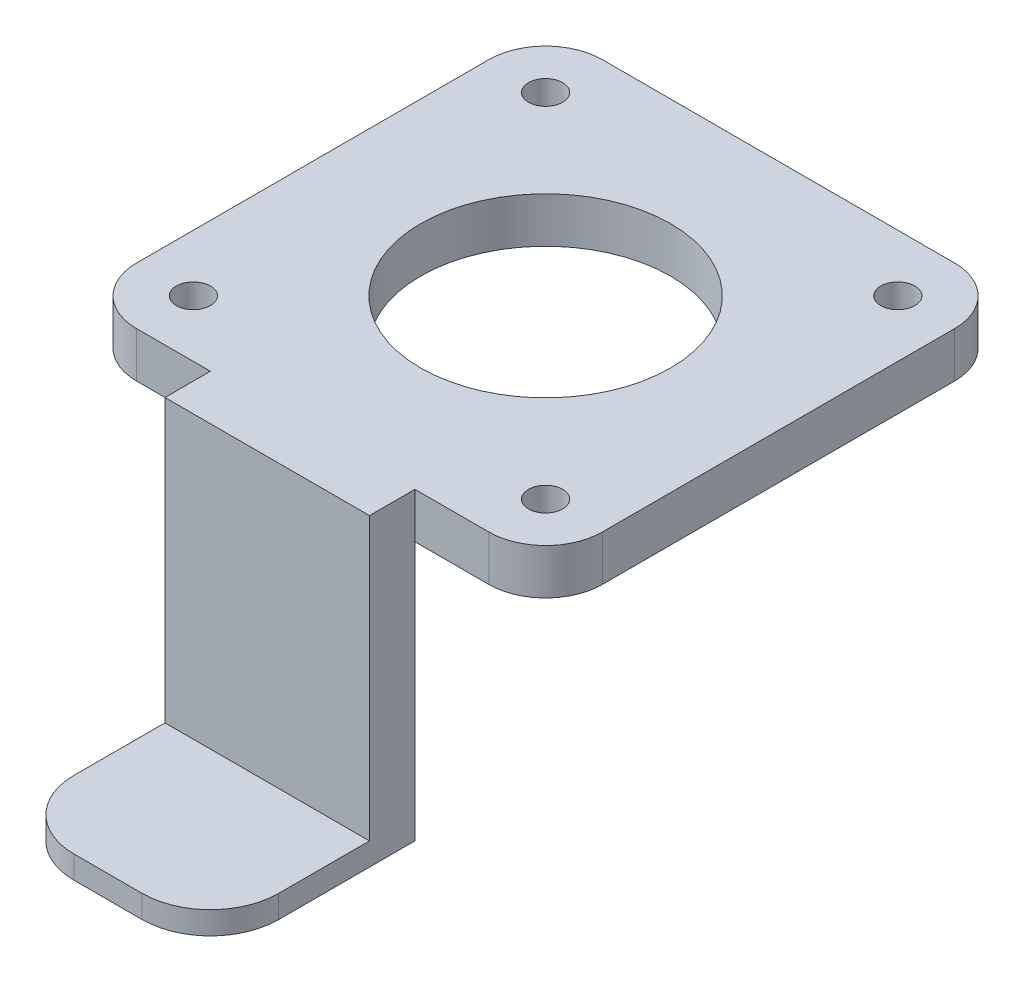
ISO-10303-21;
HEADER;
FILE_DESCRIPTION(('STEP AP214'),'2;1');
FILE_NAME('part.step','',(''),(''),'','','');
FILE_SCHEMA(('AUTOMOTIVE_DESIGN { 1 0 10303 214 1 1 1 1 }'));
ENDSEC;
DATA;
#1=APPLICATION_CONTEXT('core data for automotive mechanical design processes');
#2=APPLICATION_PROTOCOL_DEFINITION('international standard','automotive_design',2000,#1);
#3=PRODUCT_CONTEXT('',#1,'mechanical');
#4=PRODUCT('Part','Part','',(#3));
#5=PRODUCT_RELATED_PRODUCT_CATEGORY('part','',(#4));
#6=PRODUCT_DEFINITION_FORMATION('','',#4);
#7=PRODUCT_DEFINITION_CONTEXT('part definition',#1,'design');
#8=PRODUCT_DEFINITION('design','',#6,#7);
#9=PRODUCT_DEFINITION_SHAPE('','',#8);
#10=(LENGTH_UNIT() NAMED_UNIT(*) SI_UNIT(.MILLI.,.METRE.));
#11=(NAMED_UNIT(*) PLANE_ANGLE_UNIT() SI_UNIT($,.RADIAN.));
#12=(NAMED_UNIT(*) SI_UNIT($,.STERADIAN.) SOLID_ANGLE_UNIT());
#13=UNCERTAINTY_MEASURE_WITH_UNIT(LENGTH_MEASURE(1.E-05),#10,'distance_accuracy_value','');
#14=(GEOMETRIC_REPRESENTATION_CONTEXT(3) GLOBAL_UNCERTAINTY_ASSIGNED_CONTEXT((#13)) GLOBAL_UNIT_ASSIGNED_CONTEXT((#10,
#11,#12)) REPRESENTATION_CONTEXT('',''));
#15=CARTESIAN_POINT('',(0.,0.,0.));
#16=DIRECTION('',(0.,0.,1.));
#17=DIRECTION('',(1.,0.,0.));
#18=AXIS2_PLACEMENT_3D('',#15,#16,#17);
#19=CARTESIAN_POINT('',(0.,0.,24.5));
#20=DIRECTION('',(0.,0.,1.));
#21=DIRECTION('',(1.,0.,0.));
#22=AXIS2_PLACEMENT_3D('',#19,#20,#21);
#23=PLANE('',#22);
#24=DIRECTION('',(0.,-1.,0.));
#25=VECTOR('',#24,1.);
#26=CARTESIAN_POINT('',(-9.00000000000001,4.,24.5));
#27=LINE('',#26,#25);
#28=CARTESIAN_POINT('',(-9.00000000000001,4.,24.5));
#29=VERTEX_POINT('',#28);
#30=CARTESIAN_POINT('',(-9.,-20.8,24.5));
#31=VERTEX_POINT('',#30);
#32=EDGE_CURVE('E210',#29,#31,#27,.T.);
#33=ORIENTED_EDGE('',*,*,#32,.T.);
#34=DIRECTION('',(1.,0.,0.));
#35=VECTOR('',#34,1.);
#36=CARTESIAN_POINT('',(9.,-20.8,24.5));
#37=LINE('',#36,#35);
#38=CARTESIAN_POINT('',(9.,-20.8,24.5));
#39=VERTEX_POINT('',#38);
#40=EDGE_CURVE('E175',#31,#39,#37,.T.);
#41=ORIENTED_EDGE('',*,*,#40,.T.);
#42=DIRECTION('',(0.,-1.,0.));
#43=VECTOR('',#42,1.);
#44=CARTESIAN_POINT('',(8.99999999999999,4.,24.5));
#45=LINE('',#44,#43);
#46=CARTESIAN_POINT('',(8.99999999999999,4.,24.5));
#47=VERTEX_POINT('',#46);
#48=EDGE_CURVE('E186',#47,#39,#45,.T.);
#49=ORIENTED_EDGE('',*,*,#48,.F.);
#50=DIRECTION('',(1.,0.,0.));
#51=VECTOR('',#50,1.);
#52=CARTESIAN_POINT('',(-9.00000000000001,4.,24.5));
#53=LINE('',#52,#51);
#54=EDGE_CURVE('E214',#29,#47,#53,.T.);
#55=ORIENTED_EDGE('',*,*,#54,.F.);
#56=EDGE_LOOP('',(#33,#41,#49,#55));
#57=FACE_BOUND('',#56,.T.);
#58=ADVANCED_FACE('F45',(#57),#23,.T.);
#59=CARTESIAN_POINT('',(-15.5,4.,20.5));
#60=DIRECTION('',(0.,0.,-1.));
#61=DIRECTION('',(-1.,0.,0.));
#62=AXIS2_PLACEMENT_3D('',#59,#60,#61);
#63=PLANE('',#62);
#64=DIRECTION('',(0.,-1.,0.));
#65=VECTOR('',#64,1.);
#66=CARTESIAN_POINT('',(-9.00000000000001,4.,20.5));
#67=LINE('',#66,#65);
#68=CARTESIAN_POINT('',(-9.00000000000001,4.,20.5));
#69=VERTEX_POINT('',#68);
#70=CARTESIAN_POINT('',(-9.00000000000001,0.,20.5));
#71=VERTEX_POINT('',#70);
#72=EDGE_CURVE('E218',#69,#71,#67,.T.);
#73=ORIENTED_EDGE('',*,*,#72,.F.);
#74=DIRECTION('',(1.,0.,0.));
#75=VECTOR('',#74,1.);
#76=CARTESIAN_POINT('',(-15.5,4.,20.5));
#77=LINE('',#76,#75);
#78=CARTESIAN_POINT('',(-15.5,4.,20.5));
#79=VERTEX_POINT('',#78);
#80=EDGE_CURVE('E274',#79,#69,#77,.T.);
#81=ORIENTED_EDGE('',*,*,#80,.F.);
#82=DIRECTION('',(0.,-1.,0.));
#83=VECTOR('',#82,1.);
#84=CARTESIAN_POINT('',(-15.5,4.,20.5));
#85=LINE('',#84,#83);
#86=CARTESIAN_POINT('',(-15.5,0.,20.5));
#87=VERTEX_POINT('',#86);
#88=EDGE_CURVE('E318',#79,#87,#85,.T.);
#89=ORIENTED_EDGE('',*,*,#88,.T.);
#90=DIRECTION('',(1.,0.,0.));
#91=VECTOR('',#90,1.);
#92=CARTESIAN_POINT('',(-15.5,0.,20.5));
#93=LINE('',#92,#91);
#94=EDGE_CURVE('E293',#87,#71,#93,.T.);
#95=ORIENTED_EDGE('',*,*,#94,.T.);
#96=EDGE_LOOP('',(#73,#81,#89,#95));
#97=FACE_BOUND('',#96,.T.);
#98=ADVANCED_FACE('F337',(#97),#63,.F.);
#99=CARTESIAN_POINT('',(-15.5,4.,-15.5));
#100=DIRECTION('',(0.,1.,0.));
#101=DIRECTION('',(0.,0.,1.));
#102=AXIS2_PLACEMENT_3D('',#99,#100,#101);
#103=PLANE('',#102);
#104=CARTESIAN_POINT('',(-15.5,4.,15.5));
#105=DIRECTION('',(0.,1.,0.));
#106=DIRECTION('',(0.,0.,-1.));
#107=AXIS2_PLACEMENT_3D('',#104,#105,#106);
#108=CIRCLE('',#107,1.5);
#109=CARTESIAN_POINT('',(-15.5,4.,14.));
#110=VERTEX_POINT('',#109);
#111=EDGE_CURVE('E241',#110,#110,#108,.T.);
#112=ORIENTED_EDGE('',*,*,#111,.F.);
#113=EDGE_LOOP('',(#112));
#114=FACE_BOUND('',#113,.T.);
#115=CARTESIAN_POINT('',(-15.5,4.,-15.5));
#116=DIRECTION('',(0.,1.,0.));
#117=DIRECTION('',(0.,0.,1.));
#118=AXIS2_PLACEMENT_3D('',#115,#116,#117);
#119=CIRCLE('',#118,1.5);
#120=CARTESIAN_POINT('',(-15.5,4.,-14.));
#121=VERTEX_POINT('',#120);
#122=EDGE_CURVE('E253',#121,#121,#119,.T.);
#123=ORIENTED_EDGE('',*,*,#122,.F.);
#124=EDGE_LOOP('',(#123));
#125=FACE_BOUND('',#124,.T.);
#126=CARTESIAN_POINT('',(-15.5,4.,-15.5));
#127=DIRECTION('',(0.,1.,0.));
#128=DIRECTION('',(0.,0.,1.));
#129=AXIS2_PLACEMENT_3D('',#126,#127,#128);
#130=CIRCLE('',#129,5.);
#131=CARTESIAN_POINT('',(-15.5,4.,-20.5));
#132=VERTEX_POINT('',#131);
#133=CARTESIAN_POINT('',(-20.5,4.,-15.5));
#134=VERTEX_POINT('',#133);
#135=EDGE_CURVE('E265',#132,#134,#130,.T.);
#136=ORIENTED_EDGE('',*,*,#135,.T.);
#137=DIRECTION('',(0.,0.,1.));
#138=VECTOR('',#137,1.);
#139=CARTESIAN_POINT('',(-20.5,4.,15.5));
#140=LINE('',#139,#138);
#141=CARTESIAN_POINT('',(-20.5,4.,15.5));
#142=VERTEX_POINT('',#141);
#143=EDGE_CURVE('E268',#134,#142,#140,.T.);
#144=ORIENTED_EDGE('',*,*,#143,.T.);
#145=CARTESIAN_POINT('',(-15.5,4.,15.5));
#146=DIRECTION('',(0.,1.,0.));
#147=DIRECTION('',(0.,0.,-1.));
#148=AXIS2_PLACEMENT_3D('',#145,#146,#147);
#149=CIRCLE('',#148,5.);
#150=EDGE_CURVE('E271',#142,#79,#149,.T.);
#151=ORIENTED_EDGE('',*,*,#150,.T.);
#152=ORIENTED_EDGE('',*,*,#80,.T.);
#153=DIRECTION('',(0.,0.,-1.));
#154=VECTOR('',#153,1.);
#155=CARTESIAN_POINT('',(-9.00000000000001,4.,24.5));
#156=LINE('',#155,#154);
#157=EDGE_CURVE('E217',#29,#69,#156,.T.);
#158=ORIENTED_EDGE('',*,*,#157,.F.);
#159=ORIENTED_EDGE('',*,*,#54,.T.);
#160=DIRECTION('',(0.,0.,-1.));
#161=VECTOR('',#160,1.);
#162=CARTESIAN_POINT('',(8.99999999999999,4.,24.5));
#163=LINE('',#162,#161);
#164=CARTESIAN_POINT('',(8.99999999999999,4.,20.5));
#165=VERTEX_POINT('',#164);
#166=EDGE_CURVE('E227',#47,#165,#163,.T.);
#167=ORIENTED_EDGE('',*,*,#166,.T.);
#168=CARTESIAN_POINT('',(15.5,4.,20.5));
#169=VERTEX_POINT('',#168);
#170=EDGE_CURVE('E273',#165,#169,#77,.T.);
#171=ORIENTED_EDGE('',*,*,#170,.T.);
#172=CARTESIAN_POINT('',(15.5,4.,15.5));
#173=DIRECTION('',(0.,1.,0.));
#174=DIRECTION('',(0.,0.,1.));
#175=AXIS2_PLACEMENT_3D('',#172,#173,#174);
#176=CIRCLE('',#175,5.);
#177=CARTESIAN_POINT('',(20.5,4.,15.5));
#178=VERTEX_POINT('',#177);
#179=EDGE_CURVE('E277',#169,#178,#176,.T.);
#180=ORIENTED_EDGE('',*,*,#179,.T.);
#181=DIRECTION('',(0.,0.,-1.));
#182=VECTOR('',#181,1.);
#183=CARTESIAN_POINT('',(20.5,4.,15.5));
#184=LINE('',#183,#182);
#185=CARTESIAN_POINT('',(20.5,4.,-15.5));
#186=VERTEX_POINT('',#185);
#187=EDGE_CURVE('E279',#178,#186,#184,.T.);
#188=ORIENTED_EDGE('',*,*,#187,.T.);
#189=CARTESIAN_POINT('',(15.5,4.,-15.5));
#190=DIRECTION('',(0.,1.,0.));
#191=DIRECTION('',(0.,0.,1.));
#192=AXIS2_PLACEMENT_3D('',#189,#190,#191);
#193=CIRCLE('',#192,5.);
#194=CARTESIAN_POINT('',(15.5,4.,-20.5));
#195=VERTEX_POINT('',#194);
#196=EDGE_CURVE('E281',#186,#195,#193,.T.);
#197=ORIENTED_EDGE('',*,*,#196,.T.);
#198=DIRECTION('',(-1.,0.,0.));
#199=VECTOR('',#198,1.);
#200=CARTESIAN_POINT('',(-15.5,4.,-20.5));
#201=LINE('',#200,#199);
#202=EDGE_CURVE('E283',#195,#132,#201,.T.);
#203=ORIENTED_EDGE('',*,*,#202,.T.);
#204=EDGE_LOOP('',(#136,#144,#151,#152,#158,#159,#167,#171,#180,#188,#197,#203));
#205=FACE_BOUND('',#204,.T.);
#206=CARTESIAN_POINT('',(0.,4.,0.));
#207=DIRECTION('',(0.,1.,0.));
#208=DIRECTION('',(0.,0.,1.));
#209=AXIS2_PLACEMENT_3D('',#206,#207,#208);
#210=CIRCLE('',#209,11.);
#211=CARTESIAN_POINT('',(0.,4.,11.));
#212=VERTEX_POINT('',#211);
#213=EDGE_CURVE('E259',#212,#212,#210,.T.);
#214=ORIENTED_EDGE('',*,*,#213,.F.);
#215=EDGE_LOOP('',(#214));
#216=FACE_BOUND('',#215,.T.);
#217=CARTESIAN_POINT('',(15.5,4.,15.5));
#218=DIRECTION('',(0.,1.,0.));
#219=DIRECTION('',(0.,0.,-1.));
#220=AXIS2_PLACEMENT_3D('',#217,#218,#219);
#221=CIRCLE('',#220,1.5);
#222=CARTESIAN_POINT('',(15.5,4.,14.));
#223=VERTEX_POINT('',#222);
#224=EDGE_CURVE('E247',#223,#223,#221,.T.);
#225=ORIENTED_EDGE('',*,*,#224,.F.);
#226=EDGE_LOOP('',(#225));
#227=FACE_BOUND('',#226,.T.);
#228=CARTESIAN_POINT('',(15.5,4.,-15.5));
#229=DIRECTION('',(0.,1.,0.));
#230=DIRECTION('',(0.,0.,1.));
#231=AXIS2_PLACEMENT_3D('',#228,#229,#230);
#232=CIRCLE('',#231,1.49999999999999);
#233=CARTESIAN_POINT('',(15.5,4.,-14.));
#234=VERTEX_POINT('',#233);
#235=EDGE_CURVE('E235',#234,#234,#232,.T.);
#236=ORIENTED_EDGE('',*,*,#235,.F.);
#237=EDGE_LOOP('',(#236));
#238=FACE_BOUND('',#237,.T.);
#239=ADVANCED_FACE('F340',(#114,#125,#205,#216,#227,#238),#103,.T.);
#240=CARTESIAN_POINT('',(-15.5,0.,-15.5));
#241=DIRECTION('',(0.,1.,0.));
#242=DIRECTION('',(0.,0.,1.));
#243=AXIS2_PLACEMENT_3D('',#240,#241,#242);
#244=PLANE('',#243);
#245=CARTESIAN_POINT('',(-15.5,0.,-15.5));
#246=DIRECTION('',(0.,1.,0.));
#247=DIRECTION('',(0.,0.,1.));
#248=AXIS2_PLACEMENT_3D('',#245,#246,#247);
#249=CIRCLE('',#248,5.);
#250=CARTESIAN_POINT('',(-15.5,0.,-20.5));
#251=VERTEX_POINT('',#250);
#252=CARTESIAN_POINT('',(-20.5,0.,-15.5));
#253=VERTEX_POINT('',#252);
#254=EDGE_CURVE('E262',#251,#253,#249,.T.);
#255=ORIENTED_EDGE('',*,*,#254,.F.);
#256=DIRECTION('',(-1.,0.,0.));
#257=VECTOR('',#256,1.);
#258=CARTESIAN_POINT('',(-15.5,0.,-20.5));
#259=LINE('',#258,#257);
#260=CARTESIAN_POINT('',(15.5,0.,-20.5));
#261=VERTEX_POINT('',#260);
#262=EDGE_CURVE('E269',#261,#251,#259,.T.);
#263=ORIENTED_EDGE('',*,*,#262,.F.);
#264=CARTESIAN_POINT('',(15.5,0.,-15.5));
#265=DIRECTION('',(0.,1.,0.));
#266=DIRECTION('',(0.,0.,1.));
#267=AXIS2_PLACEMENT_3D('',#264,#265,#266);
#268=CIRCLE('',#267,5.);
#269=CARTESIAN_POINT('',(20.5,0.,-15.5));
#270=VERTEX_POINT('',#269);
#271=EDGE_CURVE('E301',#270,#261,#268,.T.);
#272=ORIENTED_EDGE('',*,*,#271,.F.);
#273=DIRECTION('',(0.,0.,-1.));
#274=VECTOR('',#273,1.);
#275=CARTESIAN_POINT('',(20.5,0.,15.5));
#276=LINE('',#275,#274);
#277=CARTESIAN_POINT('',(20.5,0.,15.5));
#278=VERTEX_POINT('',#277);
#279=EDGE_CURVE('E299',#278,#270,#276,.T.);
#280=ORIENTED_EDGE('',*,*,#279,.F.);
#281=CARTESIAN_POINT('',(15.5,0.,15.5));
#282=DIRECTION('',(0.,1.,0.));
#283=DIRECTION('',(0.,0.,1.));
#284=AXIS2_PLACEMENT_3D('',#281,#282,#283);
#285=CIRCLE('',#284,5.);
#286=CARTESIAN_POINT('',(15.5,0.,20.5));
#287=VERTEX_POINT('',#286);
#288=EDGE_CURVE('E296',#287,#278,#285,.T.);
#289=ORIENTED_EDGE('',*,*,#288,.F.);
#290=CARTESIAN_POINT('',(8.99999999999999,0.,20.5));
#291=VERTEX_POINT('',#290);
#292=EDGE_CURVE('E292',#291,#287,#93,.T.);
#293=ORIENTED_EDGE('',*,*,#292,.F.);
#294=EDGE_CURVE('E297',#71,#291,#93,.T.);
#295=ORIENTED_EDGE('',*,*,#294,.F.);
#296=ORIENTED_EDGE('',*,*,#94,.F.);
#297=CARTESIAN_POINT('',(-15.5,0.,15.5));
#298=DIRECTION('',(0.,1.,0.));
#299=DIRECTION('',(0.,0.,-1.));
#300=AXIS2_PLACEMENT_3D('',#297,#298,#299);
#301=CIRCLE('',#300,5.);
#302=CARTESIAN_POINT('',(-20.5,0.,15.5));
#303=VERTEX_POINT('',#302);
#304=EDGE_CURVE('E290',#303,#87,#301,.T.);
#305=ORIENTED_EDGE('',*,*,#304,.F.);
#306=DIRECTION('',(0.,0.,1.));
#307=VECTOR('',#306,1.);
#308=CARTESIAN_POINT('',(-20.5,0.,15.5));
#309=LINE('',#308,#307);
#310=EDGE_CURVE('E288',#253,#303,#309,.T.);
#311=ORIENTED_EDGE('',*,*,#310,.F.);
#312=EDGE_LOOP('',(#255,#263,#272,#280,#289,#293,#295,#296,#305,#311));
#313=FACE_BOUND('',#312,.T.);
#314=CARTESIAN_POINT('',(0.,0.,0.));
#315=DIRECTION('',(0.,1.,0.));
#316=DIRECTION('',(0.,0.,1.));
#317=AXIS2_PLACEMENT_3D('',#314,#315,#316);
#318=CIRCLE('',#317,11.);
#319=CARTESIAN_POINT('',(0.,0.,11.));
#320=VERTEX_POINT('',#319);
#321=EDGE_CURVE('E256',#320,#320,#318,.T.);
#322=ORIENTED_EDGE('',*,*,#321,.T.);
#323=EDGE_LOOP('',(#322));
#324=FACE_BOUND('',#323,.T.);
#325=CARTESIAN_POINT('',(-15.5,0.,-15.5));
#326=DIRECTION('',(0.,1.,0.));
#327=DIRECTION('',(0.,0.,1.));
#328=AXIS2_PLACEMENT_3D('',#325,#326,#327);
#329=CIRCLE('',#328,1.5);
#330=CARTESIAN_POINT('',(-15.5,0.,-14.));
#331=VERTEX_POINT('',#330);
#332=EDGE_CURVE('E250',#331,#331,#329,.T.);
#333=ORIENTED_EDGE('',*,*,#332,.T.);
#334=EDGE_LOOP('',(#333));
#335=FACE_BOUND('',#334,.T.);
#336=CARTESIAN_POINT('',(15.5,0.,15.5));
#337=DIRECTION('',(0.,1.,0.));
#338=DIRECTION('',(0.,0.,-1.));
#339=AXIS2_PLACEMENT_3D('',#336,#337,#338);
#340=CIRCLE('',#339,1.5);
#341=CARTESIAN_POINT('',(15.5,0.,14.));
#342=VERTEX_POINT('',#341);
#343=EDGE_CURVE('E244',#342,#342,#340,.T.);
#344=ORIENTED_EDGE('',*,*,#343,.T.);
#345=EDGE_LOOP('',(#344));
#346=FACE_BOUND('',#345,.T.);
#347=CARTESIAN_POINT('',(-15.5,0.,15.5));
#348=DIRECTION('',(0.,1.,0.));
#349=DIRECTION('',(0.,0.,-1.));
#350=AXIS2_PLACEMENT_3D('',#347,#348,#349);
#351=CIRCLE('',#350,1.5);
#352=CARTESIAN_POINT('',(-15.5,0.,14.));
#353=VERTEX_POINT('',#352);
#354=EDGE_CURVE('E238',#353,#353,#351,.T.);
#355=ORIENTED_EDGE('',*,*,#354,.T.);
#356=EDGE_LOOP('',(#355));
#357=FACE_BOUND('',#356,.T.);
#358=CARTESIAN_POINT('',(15.5,0.,-15.5));
#359=DIRECTION('',(0.,1.,0.));
#360=DIRECTION('',(0.,0.,1.));
#361=AXIS2_PLACEMENT_3D('',#358,#359,#360);
#362=CIRCLE('',#361,1.49999999999999);
#363=CARTESIAN_POINT('',(15.5,0.,-14.));
#364=VERTEX_POINT('',#363);
#365=EDGE_CURVE('E234',#364,#364,#362,.T.);
#366=ORIENTED_EDGE('',*,*,#365,.T.);
#367=EDGE_LOOP('',(#366));
#368=FACE_BOUND('',#367,.T.);
#369=ADVANCED_FACE('F331',(#313,#324,#335,#346,#357,#368),#244,.F.);
#370=CARTESIAN_POINT('',(-15.5,4.,-15.5));
#371=DIRECTION('',(0.,-1.,0.));
#372=DIRECTION('',(0.,0.,-1.));
#373=AXIS2_PLACEMENT_3D('',#370,#371,#372);
#374=CYLINDRICAL_SURFACE('',#373,5.);
#375=ORIENTED_EDGE('',*,*,#254,.T.);
#376=DIRECTION('',(0.,-1.,0.));
#377=VECTOR('',#376,1.);
#378=CARTESIAN_POINT('',(-20.5,4.,-15.5));
#379=LINE('',#378,#377);
#380=EDGE_CURVE('E11',#134,#253,#379,.T.);
#381=ORIENTED_EDGE('',*,*,#380,.F.);
#382=ORIENTED_EDGE('',*,*,#135,.F.);
#383=DIRECTION('',(0.,-1.,0.));
#384=VECTOR('',#383,1.);
#385=CARTESIAN_POINT('',(-15.5,4.,-20.5));
#386=LINE('',#385,#384);
#387=EDGE_CURVE('E285',#132,#251,#386,.T.);
#388=ORIENTED_EDGE('',*,*,#387,.T.);
#389=EDGE_LOOP('',(#375,#381,#382,#388));
#390=FACE_BOUND('',#389,.T.);
#391=ADVANCED_FACE('F47',(#390),#374,.T.);
#392=CARTESIAN_POINT('',(-20.5,4.,15.5));
#393=DIRECTION('',(1.,0.,0.));
#394=DIRECTION('',(0.,0.,-1.));
#395=AXIS2_PLACEMENT_3D('',#392,#393,#394);
#396=PLANE('',#395);
#397=ORIENTED_EDGE('',*,*,#310,.T.);
#398=DIRECTION('',(0.,-1.,0.));
#399=VECTOR('',#398,1.);
#400=CARTESIAN_POINT('',(-20.5,4.,15.5));
#401=LINE('',#400,#399);
#402=EDGE_CURVE('E53',#142,#303,#401,.T.);
#403=ORIENTED_EDGE('',*,*,#402,.F.);
#404=ORIENTED_EDGE('',*,*,#143,.F.);
#405=ORIENTED_EDGE('',*,*,#380,.T.);
#406=EDGE_LOOP('',(#397,#403,#404,#405));
#407=FACE_BOUND('',#406,.T.);
#408=ADVANCED_FACE('F345',(#407),#396,.F.);
#409=CARTESIAN_POINT('',(-15.5,4.,15.5));
#410=DIRECTION('',(0.,-1.,0.));
#411=DIRECTION('',(0.,0.,-1.));
#412=AXIS2_PLACEMENT_3D('',#409,#410,#411);
#413=CYLINDRICAL_SURFACE('',#412,5.);
#414=ORIENTED_EDGE('',*,*,#304,.T.);
#415=ORIENTED_EDGE('',*,*,#88,.F.);
#416=ORIENTED_EDGE('',*,*,#150,.F.);
#417=ORIENTED_EDGE('',*,*,#402,.T.);
#418=EDGE_LOOP('',(#414,#415,#416,#417));
#419=FACE_BOUND('',#418,.T.);
#420=ADVANCED_FACE('F325',(#419),#413,.T.);
#421=ORIENTED_EDGE('',*,*,#170,.F.);
#422=DIRECTION('',(0.,-1.,0.));
#423=VECTOR('',#422,1.);
#424=CARTESIAN_POINT('',(8.99999999999999,4.,20.5));
#425=LINE('',#424,#423);
#426=EDGE_CURVE('E68',#165,#291,#425,.T.);
#427=ORIENTED_EDGE('',*,*,#426,.T.);
#428=ORIENTED_EDGE('',*,*,#292,.T.);
#429=DIRECTION('',(0.,-1.,0.));
#430=VECTOR('',#429,1.);
#431=CARTESIAN_POINT('',(15.5,4.,20.5));
#432=LINE('',#431,#430);
#433=EDGE_CURVE('E315',#169,#287,#432,.T.);
#434=ORIENTED_EDGE('',*,*,#433,.F.);
#435=EDGE_LOOP('',(#421,#427,#428,#434));
#436=FACE_BOUND('',#435,.T.);
#437=ADVANCED_FACE('F370',(#436),#63,.F.);
#438=CARTESIAN_POINT('',(15.5,4.,15.5));
#439=DIRECTION('',(0.,-1.,0.));
#440=DIRECTION('',(0.,0.,-1.));
#441=AXIS2_PLACEMENT_3D('',#438,#439,#440);
#442=CYLINDRICAL_SURFACE('',#441,5.);
#443=ORIENTED_EDGE('',*,*,#288,.T.);
#444=DIRECTION('',(0.,-1.,0.));
#445=VECTOR('',#444,1.);
#446=CARTESIAN_POINT('',(20.5,4.,15.5));
#447=LINE('',#446,#445);
#448=EDGE_CURVE('E312',#178,#278,#447,.T.);
#449=ORIENTED_EDGE('',*,*,#448,.F.);
#450=ORIENTED_EDGE('',*,*,#179,.F.);
#451=ORIENTED_EDGE('',*,*,#433,.T.);
#452=EDGE_LOOP('',(#443,#449,#450,#451));
#453=FACE_BOUND('',#452,.T.);
#454=ADVANCED_FACE('F365',(#453),#442,.T.);
#455=CARTESIAN_POINT('',(20.5,4.,15.5));
#456=DIRECTION('',(-1.,0.,0.));
#457=DIRECTION('',(0.,0.,1.));
#458=AXIS2_PLACEMENT_3D('',#455,#456,#457);
#459=PLANE('',#458);
#460=ORIENTED_EDGE('',*,*,#279,.T.);
#461=DIRECTION('',(0.,-1.,0.));
#462=VECTOR('',#461,1.);
#463=CARTESIAN_POINT('',(20.5,4.,-15.5));
#464=LINE('',#463,#462);
#465=EDGE_CURVE('E309',#186,#270,#464,.T.);
#466=ORIENTED_EDGE('',*,*,#465,.F.);
#467=ORIENTED_EDGE('',*,*,#187,.F.);
#468=ORIENTED_EDGE('',*,*,#448,.T.);
#469=EDGE_LOOP('',(#460,#466,#467,#468));
#470=FACE_BOUND('',#469,.T.);
#471=ADVANCED_FACE('F361',(#470),#459,.F.);
#472=CARTESIAN_POINT('',(15.5,4.,-15.5));
#473=DIRECTION('',(0.,-1.,0.));
#474=DIRECTION('',(0.,0.,-1.));
#475=AXIS2_PLACEMENT_3D('',#472,#473,#474);
#476=CYLINDRICAL_SURFACE('',#475,5.);
#477=ORIENTED_EDGE('',*,*,#271,.T.);
#478=DIRECTION('',(0.,-1.,0.));
#479=VECTOR('',#478,1.);
#480=CARTESIAN_POINT('',(15.5,4.,-20.5));
#481=LINE('',#480,#479);
#482=EDGE_CURVE('E306',#195,#261,#481,.T.);
#483=ORIENTED_EDGE('',*,*,#482,.F.);
#484=ORIENTED_EDGE('',*,*,#196,.F.);
#485=ORIENTED_EDGE('',*,*,#465,.T.);
#486=EDGE_LOOP('',(#477,#483,#484,#485));
#487=FACE_BOUND('',#486,.T.);
#488=ADVANCED_FACE('F357',(#487),#476,.T.);
#489=CARTESIAN_POINT('',(-15.5,4.,-20.5));
#490=DIRECTION('',(0.,0.,1.));
#491=DIRECTION('',(1.,0.,0.));
#492=AXIS2_PLACEMENT_3D('',#489,#490,#491);
#493=PLANE('',#492);
#494=ORIENTED_EDGE('',*,*,#262,.T.);
#495=ORIENTED_EDGE('',*,*,#387,.F.);
#496=ORIENTED_EDGE('',*,*,#202,.F.);
#497=ORIENTED_EDGE('',*,*,#482,.T.);
#498=EDGE_LOOP('',(#494,#495,#496,#497));
#499=FACE_BOUND('',#498,.T.);
#500=ADVANCED_FACE('F352',(#499),#493,.F.);
#501=CARTESIAN_POINT('',(0.,4.,0.));
#502=DIRECTION('',(0.,-1.,0.));
#503=DIRECTION('',(0.,0.,-1.));
#504=AXIS2_PLACEMENT_3D('',#501,#502,#503);
#505=CYLINDRICAL_SURFACE('',#504,11.);
#506=ORIENTED_EDGE('',*,*,#213,.T.);
#507=EDGE_LOOP('',(#506));
#508=FACE_BOUND('',#507,.T.);
#509=ORIENTED_EDGE('',*,*,#321,.F.);
#510=EDGE_LOOP('',(#509));
#511=FACE_BOUND('',#510,.T.);
#512=ADVANCED_FACE('F424',(#508,#511),#505,.F.);
#513=CARTESIAN_POINT('',(-15.5,4.,-15.5));
#514=DIRECTION('',(0.,-1.,0.));
#515=DIRECTION('',(0.,0.,-1.));
#516=AXIS2_PLACEMENT_3D('',#513,#514,#515);
#517=CYLINDRICAL_SURFACE('',#516,1.5);
#518=ORIENTED_EDGE('',*,*,#122,.T.);
#519=EDGE_LOOP('',(#518));
#520=FACE_BOUND('',#519,.T.);
#521=ORIENTED_EDGE('',*,*,#332,.F.);
#522=EDGE_LOOP('',(#521));
#523=FACE_BOUND('',#522,.T.);
#524=ADVANCED_FACE('F420',(#520,#523),#517,.F.);
#525=CARTESIAN_POINT('',(15.5,4.,15.5));
#526=DIRECTION('',(0.,-1.,0.));
#527=DIRECTION('',(0.,0.,-1.));
#528=AXIS2_PLACEMENT_3D('',#525,#526,#527);
#529=CYLINDRICAL_SURFACE('',#528,1.5);
#530=ORIENTED_EDGE('',*,*,#224,.T.);
#531=EDGE_LOOP('',(#530));
#532=FACE_BOUND('',#531,.T.);
#533=ORIENTED_EDGE('',*,*,#343,.F.);
#534=EDGE_LOOP('',(#533));
#535=FACE_BOUND('',#534,.T.);
#536=ADVANCED_FACE('F416',(#532,#535),#529,.F.);
#537=CARTESIAN_POINT('',(-15.5,4.,15.5));
#538=DIRECTION('',(0.,-1.,0.));
#539=DIRECTION('',(0.,0.,-1.));
#540=AXIS2_PLACEMENT_3D('',#537,#538,#539);
#541=CYLINDRICAL_SURFACE('',#540,1.5);
#542=ORIENTED_EDGE('',*,*,#111,.T.);
#543=EDGE_LOOP('',(#542));
#544=FACE_BOUND('',#543,.T.);
#545=ORIENTED_EDGE('',*,*,#354,.F.);
#546=EDGE_LOOP('',(#545));
#547=FACE_BOUND('',#546,.T.);
#548=ADVANCED_FACE('F412',(#544,#547),#541,.F.);
#549=CARTESIAN_POINT('',(15.5,4.,-15.5));
#550=DIRECTION('',(0.,-1.,0.));
#551=DIRECTION('',(0.,0.,-1.));
#552=AXIS2_PLACEMENT_3D('',#549,#550,#551);
#553=CYLINDRICAL_SURFACE('',#552,1.49999999999999);
#554=ORIENTED_EDGE('',*,*,#235,.T.);
#555=EDGE_LOOP('',(#554));
#556=FACE_BOUND('',#555,.T.);
#557=ORIENTED_EDGE('',*,*,#365,.F.);
#558=EDGE_LOOP('',(#557));
#559=FACE_BOUND('',#558,.T.);
#560=ADVANCED_FACE('F404',(#556,#559),#553,.F.);
#561=CARTESIAN_POINT('',(0.,0.,20.5));
#562=DIRECTION('',(0.,0.,1.));
#563=DIRECTION('',(1.,0.,0.));
#564=AXIS2_PLACEMENT_3D('',#561,#562,#563);
#565=PLANE('',#564);
#566=CARTESIAN_POINT('',(-9.,-22.8,20.5));
#567=VERTEX_POINT('',#566);
#568=EDGE_CURVE('E206',#71,#567,#67,.T.);
#569=ORIENTED_EDGE('',*,*,#568,.F.);
#570=ORIENTED_EDGE('',*,*,#294,.T.);
#571=CARTESIAN_POINT('',(9.,-22.8,20.5));
#572=VERTEX_POINT('',#571);
#573=EDGE_CURVE('E224',#291,#572,#425,.T.);
#574=ORIENTED_EDGE('',*,*,#573,.T.);
#575=DIRECTION('',(1.,0.,0.));
#576=VECTOR('',#575,1.);
#577=CARTESIAN_POINT('',(-9.,-22.8,20.5));
#578=LINE('',#577,#576);
#579=EDGE_CURVE('E221',#567,#572,#578,.T.);
#580=ORIENTED_EDGE('',*,*,#579,.F.);
#581=EDGE_LOOP('',(#569,#570,#574,#580));
#582=FACE_BOUND('',#581,.T.);
#583=ADVANCED_FACE('F372',(#582),#565,.F.);
#584=CARTESIAN_POINT('',(-9.00000000000001,4.,24.5));
#585=DIRECTION('',(1.,0.,0.));
#586=DIRECTION('',(0.,1.,0.));
#587=AXIS2_PLACEMENT_3D('',#584,#585,#586);
#588=PLANE('',#587);
#589=ORIENTED_EDGE('',*,*,#72,.T.);
#590=ORIENTED_EDGE('',*,*,#568,.T.);
#591=DIRECTION('',(0.,0.,-1.));
#592=VECTOR('',#591,1.);
#593=CARTESIAN_POINT('',(-9.,-22.8,24.5));
#594=LINE('',#593,#592);
#595=CARTESIAN_POINT('',(-9.,-22.8,32.5));
#596=VERTEX_POINT('',#595);
#597=EDGE_CURVE('E231',#596,#567,#594,.T.);
#598=ORIENTED_EDGE('',*,*,#597,.F.);
#599=DIRECTION('',(0.,-1.,0.));
#600=VECTOR('',#599,1.);
#601=CARTESIAN_POINT('',(-9.,-20.8,32.5));
#602=LINE('',#601,#600);
#603=CARTESIAN_POINT('',(-9.,-20.8,32.5));
#604=VERTEX_POINT('',#603);
#605=EDGE_CURVE('E203',#604,#596,#602,.T.);
#606=ORIENTED_EDGE('',*,*,#605,.F.);
#607=DIRECTION('',(0.,0.,-1.));
#608=VECTOR('',#607,1.);
#609=CARTESIAN_POINT('',(-9.,-20.8,24.5));
#610=LINE('',#609,#608);
#611=EDGE_CURVE('E197',#604,#31,#610,.T.);
#612=ORIENTED_EDGE('',*,*,#611,.T.);
#613=ORIENTED_EDGE('',*,*,#32,.F.);
#614=ORIENTED_EDGE('',*,*,#157,.T.);
#615=EDGE_LOOP('',(#589,#590,#598,#606,#612,#613,#614));
#616=FACE_BOUND('',#615,.T.);
#617=ADVANCED_FACE('F378',(#616),#588,.F.);
#618=CARTESIAN_POINT('',(-9.,-22.8,24.5));
#619=DIRECTION('',(0.,1.,0.));
#620=DIRECTION('',(0.,0.,1.));
#621=AXIS2_PLACEMENT_3D('',#618,#619,#620);
#622=PLANE('',#621);
#623=ORIENTED_EDGE('',*,*,#579,.T.);
#624=DIRECTION('',(0.,0.,-1.));
#625=VECTOR('',#624,1.);
#626=CARTESIAN_POINT('',(9.,-22.8,24.5));
#627=LINE('',#626,#625);
#628=CARTESIAN_POINT('',(9.,-22.8,32.5));
#629=VERTEX_POINT('',#628);
#630=EDGE_CURVE('E229',#629,#572,#627,.T.);
#631=ORIENTED_EDGE('',*,*,#630,.F.);
#632=CARTESIAN_POINT('',(3.,-22.8,32.5));
#633=DIRECTION('',(0.,-1.,0.));
#634=DIRECTION('',(0.,0.,1.));
#635=AXIS2_PLACEMENT_3D('',#632,#633,#634);
#636=CIRCLE('',#635,6.);
#637=CARTESIAN_POINT('',(3.,-22.8,38.5));
#638=VERTEX_POINT('',#637);
#639=EDGE_CURVE('E172',#629,#638,#636,.T.);
#640=ORIENTED_EDGE('',*,*,#639,.T.);
#641=DIRECTION('',(-1.,0.,0.));
#642=VECTOR('',#641,1.);
#643=CARTESIAN_POINT('',(3.,-22.8,38.5));
#644=LINE('',#643,#642);
#645=CARTESIAN_POINT('',(-3.,-22.8,38.5));
#646=VERTEX_POINT('',#645);
#647=EDGE_CURVE('E190',#638,#646,#644,.T.);
#648=ORIENTED_EDGE('',*,*,#647,.T.);
#649=CARTESIAN_POINT('',(-3.,-22.8,32.5));
#650=DIRECTION('',(0.,-1.,0.));
#651=DIRECTION('',(0.,0.,-1.));
#652=AXIS2_PLACEMENT_3D('',#649,#650,#651);
#653=CIRCLE('',#652,6.);
#654=EDGE_CURVE('E187',#646,#596,#653,.T.);
#655=ORIENTED_EDGE('',*,*,#654,.T.);
#656=ORIENTED_EDGE('',*,*,#597,.T.);
#657=EDGE_LOOP('',(#623,#631,#640,#648,#655,#656));
#658=FACE_BOUND('',#657,.T.);
#659=ADVANCED_FACE('F375',(#658),#622,.F.);
#660=CARTESIAN_POINT('',(8.99999999999999,4.,24.5));
#661=DIRECTION('',(1.,0.,0.));
#662=DIRECTION('',(0.,1.,0.));
#663=AXIS2_PLACEMENT_3D('',#660,#661,#662);
#664=PLANE('',#663);
#665=ORIENTED_EDGE('',*,*,#426,.F.);
#666=ORIENTED_EDGE('',*,*,#166,.F.);
#667=ORIENTED_EDGE('',*,*,#48,.T.);
#668=DIRECTION('',(0.,0.,1.));
#669=VECTOR('',#668,1.);
#670=CARTESIAN_POINT('',(9.,-20.8,24.5));
#671=LINE('',#670,#669);
#672=CARTESIAN_POINT('',(9.,-20.8,32.5));
#673=VERTEX_POINT('',#672);
#674=EDGE_CURVE('E60',#39,#673,#671,.T.);
#675=ORIENTED_EDGE('',*,*,#674,.T.);
#676=DIRECTION('',(0.,-1.,0.));
#677=VECTOR('',#676,1.);
#678=CARTESIAN_POINT('',(9.,-20.8,32.5));
#679=LINE('',#678,#677);
#680=EDGE_CURVE('E168',#673,#629,#679,.T.);
#681=ORIENTED_EDGE('',*,*,#680,.T.);
#682=ORIENTED_EDGE('',*,*,#630,.T.);
#683=ORIENTED_EDGE('',*,*,#573,.F.);
#684=EDGE_LOOP('',(#665,#666,#667,#675,#681,#682,#683));
#685=FACE_BOUND('',#684,.T.);
#686=ADVANCED_FACE('F184',(#685),#664,.T.);
#687=CARTESIAN_POINT('',(-3.,-20.8,32.5));
#688=DIRECTION('',(0.,-1.,0.));
#689=DIRECTION('',(0.,0.,-1.));
#690=AXIS2_PLACEMENT_3D('',#687,#688,#689);
#691=CYLINDRICAL_SURFACE('',#690,6.);
#692=ORIENTED_EDGE('',*,*,#654,.F.);
#693=DIRECTION('',(0.,-1.,0.));
#694=VECTOR('',#693,1.);
#695=CARTESIAN_POINT('',(-3.,-20.8,38.5));
#696=LINE('',#695,#694);
#697=CARTESIAN_POINT('',(-3.,-20.8,38.5));
#698=VERTEX_POINT('',#697);
#699=EDGE_CURVE('E207',#698,#646,#696,.T.);
#700=ORIENTED_EDGE('',*,*,#699,.F.);
#701=CARTESIAN_POINT('',(-3.,-20.8,32.5));
#702=DIRECTION('',(0.,-1.,0.));
#703=DIRECTION('',(0.,0.,-1.));
#704=AXIS2_PLACEMENT_3D('',#701,#702,#703);
#705=CIRCLE('',#704,6.);
#706=EDGE_CURVE('E194',#698,#604,#705,.T.);
#707=ORIENTED_EDGE('',*,*,#706,.T.);
#708=ORIENTED_EDGE('',*,*,#605,.T.);
#709=EDGE_LOOP('',(#692,#700,#707,#708));
#710=FACE_BOUND('',#709,.T.);
#711=ADVANCED_FACE('F381',(#710),#691,.T.);
#712=CARTESIAN_POINT('',(3.,-20.8,38.5));
#713=DIRECTION('',(0.,0.,1.));
#714=DIRECTION('',(1.,0.,0.));
#715=AXIS2_PLACEMENT_3D('',#712,#713,#714);
#716=PLANE('',#715);
#717=ORIENTED_EDGE('',*,*,#647,.F.);
#718=DIRECTION('',(0.,-1.,0.));
#719=VECTOR('',#718,1.);
#720=CARTESIAN_POINT('',(3.,-20.8,38.5));
#721=LINE('',#720,#719);
#722=CARTESIAN_POINT('',(3.,-20.8,38.5));
#723=VERTEX_POINT('',#722);
#724=EDGE_CURVE('E174',#723,#638,#721,.T.);
#725=ORIENTED_EDGE('',*,*,#724,.F.);
#726=DIRECTION('',(-1.,0.,0.));
#727=VECTOR('',#726,1.);
#728=CARTESIAN_POINT('',(3.,-20.8,38.5));
#729=LINE('',#728,#727);
#730=EDGE_CURVE('E181',#723,#698,#729,.T.);
#731=ORIENTED_EDGE('',*,*,#730,.T.);
#732=ORIENTED_EDGE('',*,*,#699,.T.);
#733=EDGE_LOOP('',(#717,#725,#731,#732));
#734=FACE_BOUND('',#733,.T.);
#735=ADVANCED_FACE('F384',(#734),#716,.T.);
#736=CARTESIAN_POINT('',(3.,-20.8,32.5));
#737=DIRECTION('',(0.,-1.,0.));
#738=DIRECTION('',(0.,0.,-1.));
#739=AXIS2_PLACEMENT_3D('',#736,#737,#738);
#740=CYLINDRICAL_SURFACE('',#739,6.);
#741=ORIENTED_EDGE('',*,*,#639,.F.);
#742=ORIENTED_EDGE('',*,*,#680,.F.);
#743=CARTESIAN_POINT('',(3.,-20.8,32.5));
#744=DIRECTION('',(0.,-1.,0.));
#745=DIRECTION('',(0.,0.,1.));
#746=AXIS2_PLACEMENT_3D('',#743,#744,#745);
#747=CIRCLE('',#746,6.);
#748=EDGE_CURVE('E170',#673,#723,#747,.T.);
#749=ORIENTED_EDGE('',*,*,#748,.T.);
#750=ORIENTED_EDGE('',*,*,#724,.T.);
#751=EDGE_LOOP('',(#741,#742,#749,#750));
#752=FACE_BOUND('',#751,.T.);
#753=ADVANCED_FACE('F169',(#752),#740,.T.);
#754=CARTESIAN_POINT('',(3.,-20.8,32.5));
#755=DIRECTION('',(0.,1.,0.));
#756=DIRECTION('',(0.,0.,1.));
#757=AXIS2_PLACEMENT_3D('',#754,#755,#756);
#758=PLANE('',#757);
#759=ORIENTED_EDGE('',*,*,#674,.F.);
#760=ORIENTED_EDGE('',*,*,#40,.F.);
#761=ORIENTED_EDGE('',*,*,#611,.F.);
#762=ORIENTED_EDGE('',*,*,#706,.F.);
#763=ORIENTED_EDGE('',*,*,#730,.F.);
#764=ORIENTED_EDGE('',*,*,#748,.F.);
#765=EDGE_LOOP('',(#759,#760,#761,#762,#763,#764));
#766=FACE_BOUND('',#765,.T.);
#767=ADVANCED_FACE('F178',(#766),#758,.T.);
#768=CLOSED_SHELL('',(#58,#98,#239,#369,#391,#408,#420,#437,#454,#471,#488,#500,#512,#524,#536,
#548,#560,#583,#617,#659,#686,#711,#735,#753,#767));
#769=MANIFOLD_SOLID_BREP('B2',#768);
#770=ADVANCED_BREP_SHAPE_REPRESENTATION('',(#18,#769),#14);
#771=SHAPE_DEFINITION_REPRESENTATION(#9,#770);
ENDSEC;
END-ISO-10303-21;
